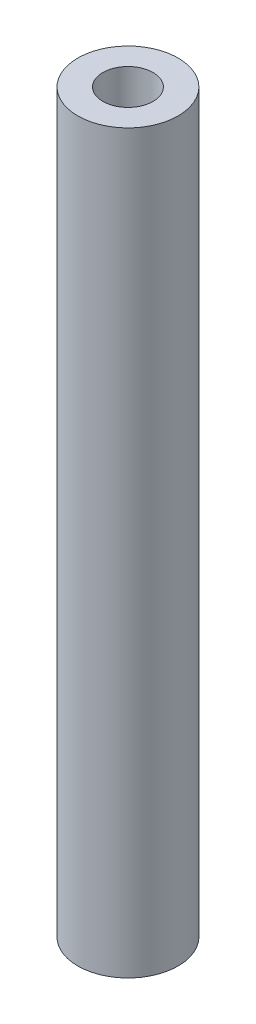
ISO-10303-21;
HEADER;
FILE_DESCRIPTION(('STEP AP214'),'2;1');
FILE_NAME('part.step','',(''),(''),'','','');
FILE_SCHEMA(('AUTOMOTIVE_DESIGN { 1 0 10303 214 1 1 1 1 }'));
ENDSEC;
DATA;
#1=APPLICATION_CONTEXT('core data for automotive mechanical design processes');
#2=APPLICATION_PROTOCOL_DEFINITION('international standard','automotive_design',2000,#1);
#3=PRODUCT_CONTEXT('',#1,'mechanical');
#4=PRODUCT('Part','Part','',(#3));
#5=PRODUCT_RELATED_PRODUCT_CATEGORY('part','',(#4));
#6=PRODUCT_DEFINITION_FORMATION('','',#4);
#7=PRODUCT_DEFINITION_CONTEXT('part definition',#1,'design');
#8=PRODUCT_DEFINITION('design','',#6,#7);
#9=PRODUCT_DEFINITION_SHAPE('','',#8);
#10=(LENGTH_UNIT() NAMED_UNIT(*) SI_UNIT(.MILLI.,.METRE.));
#11=(NAMED_UNIT(*) PLANE_ANGLE_UNIT() SI_UNIT($,.RADIAN.));
#12=(NAMED_UNIT(*) SI_UNIT($,.STERADIAN.) SOLID_ANGLE_UNIT());
#13=UNCERTAINTY_MEASURE_WITH_UNIT(LENGTH_MEASURE(1.E-05),#10,'distance_accuracy_value','');
#14=(GEOMETRIC_REPRESENTATION_CONTEXT(3) GLOBAL_UNCERTAINTY_ASSIGNED_CONTEXT((#13)) GLOBAL_UNIT_ASSIGNED_CONTEXT((#10,
#11,#12)) REPRESENTATION_CONTEXT('',''));
#15=CARTESIAN_POINT('',(0.,0.,0.));
#16=DIRECTION('',(0.,0.,1.));
#17=DIRECTION('',(1.,0.,0.));
#18=AXIS2_PLACEMENT_3D('',#15,#16,#17);
#19=CARTESIAN_POINT('',(0.,85.725,0.));
#20=DIRECTION('',(0.,1.,0.));
#21=DIRECTION('',(0.,0.,1.));
#22=AXIS2_PLACEMENT_3D('',#19,#20,#21);
#23=PLANE('',#22);
#24=CARTESIAN_POINT('',(0.,85.725,0.));
#25=DIRECTION('',(0.,1.,0.));
#26=DIRECTION('',(0.,0.,1.));
#27=AXIS2_PLACEMENT_3D('',#24,#25,#26);
#28=CIRCLE('',#27,5.842);
#29=CARTESIAN_POINT('',(0.,85.725,5.842));
#30=VERTEX_POINT('',#29);
#31=EDGE_CURVE('E11',#30,#30,#28,.T.);
#32=ORIENTED_EDGE('',*,*,#31,.T.);
#33=EDGE_LOOP('',(#32));
#34=FACE_BOUND('',#33,.T.);
#35=CARTESIAN_POINT('',(0.,85.725,0.));
#36=DIRECTION('',(0.,1.,0.));
#37=DIRECTION('',(0.,0.,1.));
#38=AXIS2_PLACEMENT_3D('',#35,#36,#37);
#39=CIRCLE('',#38,2.921);
#40=CARTESIAN_POINT('',(0.,85.725,2.921));
#41=VERTEX_POINT('',#40);
#42=EDGE_CURVE('E55',#41,#41,#39,.T.);
#43=ORIENTED_EDGE('',*,*,#42,.F.);
#44=EDGE_LOOP('',(#43));
#45=FACE_BOUND('',#44,.T.);
#46=ADVANCED_FACE('F42',(#34,#45),#23,.T.);
#47=CARTESIAN_POINT('',(0.,0.,0.));
#48=DIRECTION('',(0.,1.,0.));
#49=DIRECTION('',(0.,0.,1.));
#50=AXIS2_PLACEMENT_3D('',#47,#48,#49);
#51=PLANE('',#50);
#52=CARTESIAN_POINT('',(0.,0.,0.));
#53=DIRECTION('',(0.,1.,0.));
#54=DIRECTION('',(0.,0.,1.));
#55=AXIS2_PLACEMENT_3D('',#52,#53,#54);
#56=CIRCLE('',#55,5.842);
#57=CARTESIAN_POINT('',(0.,0.,5.842));
#58=VERTEX_POINT('',#57);
#59=EDGE_CURVE('E46',#58,#58,#56,.T.);
#60=ORIENTED_EDGE('',*,*,#59,.F.);
#61=EDGE_LOOP('',(#60));
#62=FACE_BOUND('',#61,.T.);
#63=CARTESIAN_POINT('',(0.,0.,0.));
#64=DIRECTION('',(0.,1.,0.));
#65=DIRECTION('',(0.,0.,1.));
#66=AXIS2_PLACEMENT_3D('',#63,#64,#65);
#67=CIRCLE('',#66,2.921);
#68=CARTESIAN_POINT('',(0.,0.,2.921));
#69=VERTEX_POINT('',#68);
#70=EDGE_CURVE('E57',#69,#69,#67,.T.);
#71=ORIENTED_EDGE('',*,*,#70,.T.);
#72=EDGE_LOOP('',(#71));
#73=FACE_BOUND('',#72,.T.);
#74=ADVANCED_FACE('F69',(#62,#73),#51,.F.);
#75=CARTESIAN_POINT('',(0.,85.725,0.));
#76=DIRECTION('',(0.,-1.,0.));
#77=DIRECTION('',(0.,0.,-1.));
#78=AXIS2_PLACEMENT_3D('',#75,#76,#77);
#79=CYLINDRICAL_SURFACE('',#78,5.842);
#80=ORIENTED_EDGE('',*,*,#31,.F.);
#81=EDGE_LOOP('',(#80));
#82=FACE_BOUND('',#81,.T.);
#83=ORIENTED_EDGE('',*,*,#59,.T.);
#84=EDGE_LOOP('',(#83));
#85=FACE_BOUND('',#84,.T.);
#86=ADVANCED_FACE('F44',(#82,#85),#79,.T.);
#87=CARTESIAN_POINT('',(0.,85.725,0.));
#88=DIRECTION('',(0.,-1.,0.));
#89=DIRECTION('',(0.,0.,-1.));
#90=AXIS2_PLACEMENT_3D('',#87,#88,#89);
#91=CYLINDRICAL_SURFACE('',#90,2.921);
#92=ORIENTED_EDGE('',*,*,#42,.T.);
#93=EDGE_LOOP('',(#92));
#94=FACE_BOUND('',#93,.T.);
#95=ORIENTED_EDGE('',*,*,#70,.F.);
#96=EDGE_LOOP('',(#95));
#97=FACE_BOUND('',#96,.T.);
#98=ADVANCED_FACE('F65',(#94,#97),#91,.F.);
#99=CLOSED_SHELL('',(#46,#74,#86,#98));
#100=MANIFOLD_SOLID_BREP('B2',#99);
#101=ADVANCED_BREP_SHAPE_REPRESENTATION('',(#18,#100),#14);
#102=SHAPE_DEFINITION_REPRESENTATION(#9,#101);
ENDSEC;
END-ISO-10303-21;
